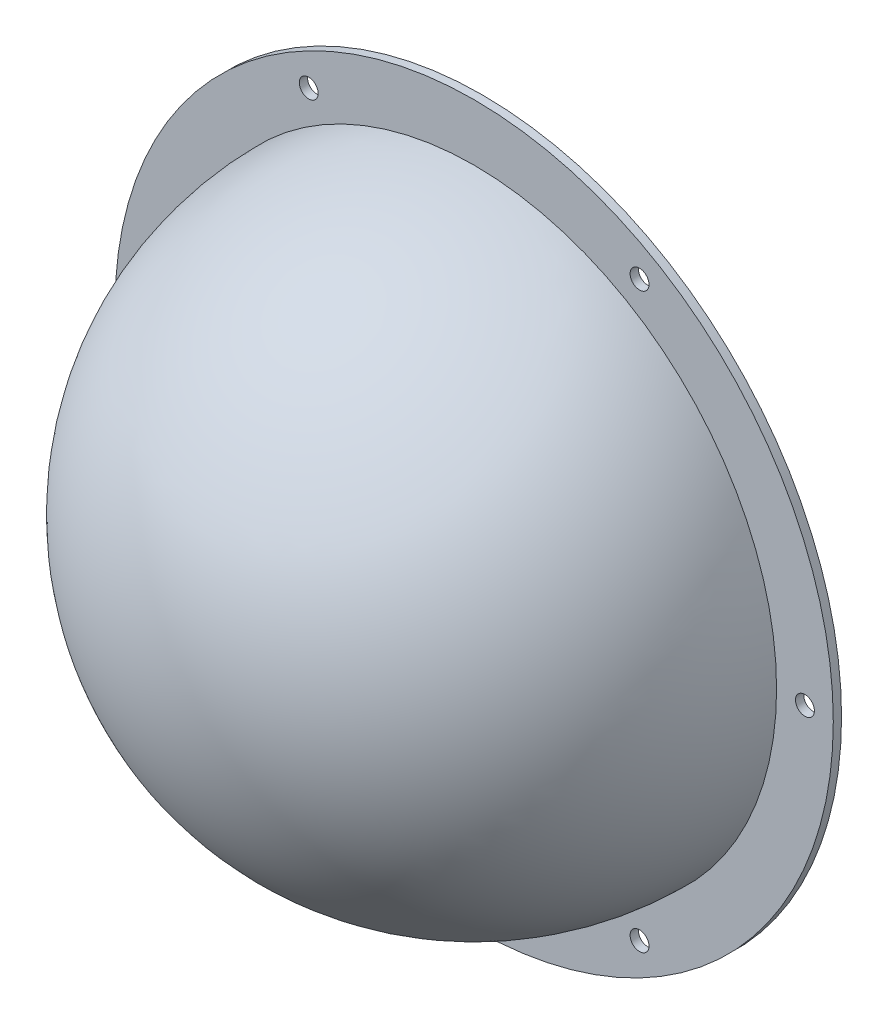
ISO-10303-21;
HEADER;
FILE_DESCRIPTION(('STEP AP214'),'2;1');
FILE_NAME('part.step','',(''),(''),'','','');
FILE_SCHEMA(('AUTOMOTIVE_DESIGN { 1 0 10303 214 1 1 1 1 }'));
ENDSEC;
DATA;
#1=APPLICATION_CONTEXT('core data for automotive mechanical design processes');
#2=APPLICATION_PROTOCOL_DEFINITION('international standard','automotive_design',2000,#1);
#3=PRODUCT_CONTEXT('',#1,'mechanical');
#4=PRODUCT('Part','Part','',(#3));
#5=PRODUCT_RELATED_PRODUCT_CATEGORY('part','',(#4));
#6=PRODUCT_DEFINITION_FORMATION('','',#4);
#7=PRODUCT_DEFINITION_CONTEXT('part definition',#1,'design');
#8=PRODUCT_DEFINITION('design','',#6,#7);
#9=PRODUCT_DEFINITION_SHAPE('','',#8);
#10=(LENGTH_UNIT() NAMED_UNIT(*) SI_UNIT(.MILLI.,.METRE.));
#11=(NAMED_UNIT(*) PLANE_ANGLE_UNIT() SI_UNIT($,.RADIAN.));
#12=(NAMED_UNIT(*) SI_UNIT($,.STERADIAN.) SOLID_ANGLE_UNIT());
#13=UNCERTAINTY_MEASURE_WITH_UNIT(LENGTH_MEASURE(1.E-05),#10,'distance_accuracy_value','');
#14=(GEOMETRIC_REPRESENTATION_CONTEXT(3) GLOBAL_UNCERTAINTY_ASSIGNED_CONTEXT((#13)) GLOBAL_UNIT_ASSIGNED_CONTEXT((#10,
#11,#12)) REPRESENTATION_CONTEXT('',''));
#15=CARTESIAN_POINT('',(0.,0.,0.));
#16=DIRECTION('',(0.,0.,1.));
#17=DIRECTION('',(1.,0.,0.));
#18=AXIS2_PLACEMENT_3D('',#15,#16,#17);
#19=CARTESIAN_POINT('',(0.,0.,0.));
#20=DIRECTION('',(0.,0.,-1.));
#21=DIRECTION('',(1.,0.,0.));
#22=AXIS2_PLACEMENT_3D('',#19,#20,#21);
#23=SPHERICAL_SURFACE('',#22,101.6);
#24=CARTESIAN_POINT('',(0.,0.,0.));
#25=DIRECTION('',(0.,0.,-1.));
#26=DIRECTION('',(-1.,0.,0.));
#27=AXIS2_PLACEMENT_3D('',#24,#25,#26);
#28=CIRCLE('',#27,101.6);
#29=CARTESIAN_POINT('',(-101.6,0.,0.));
#30=VERTEX_POINT('',#29);
#31=EDGE_CURVE('E10',#30,#30,#28,.T.);
#32=ORIENTED_EDGE('',*,*,#31,.F.);
#33=EDGE_LOOP('',(#32));
#34=FACE_BOUND('',#33,.T.);
#35=ADVANCED_FACE('F37',(#34),#23,.T.);
#36=CARTESIAN_POINT('',(120.65,0.,0.));
#37=DIRECTION('',(0.,0.,-1.));
#38=DIRECTION('',(-1.,0.,0.));
#39=AXIS2_PLACEMENT_3D('',#36,#37,#38);
#40=PLANE('',#39);
#41=CARTESIAN_POINT('',(55.5625000000011,-96.2370729955451,0.));
#42=DIRECTION('',(0.,0.,-1.));
#43=DIRECTION('',(-1.,0.,0.));
#44=AXIS2_PLACEMENT_3D('',#41,#42,#43);
#45=CIRCLE('',#44,3.175);
#46=CARTESIAN_POINT('',(52.3875000000011,-96.2370729955451,0.));
#47=VERTEX_POINT('',#46);
#48=EDGE_CURVE('E65',#47,#47,#45,.T.);
#49=ORIENTED_EDGE('',*,*,#48,.T.);
#50=EDGE_LOOP('',(#49));
#51=FACE_BOUND('',#50,.T.);
#52=CARTESIAN_POINT('',(-55.5624999999991,-96.2370729955463,0.));
#53=DIRECTION('',(0.,0.,-1.));
#54=DIRECTION('',(-1.,0.,0.));
#55=AXIS2_PLACEMENT_3D('',#52,#53,#54);
#56=CIRCLE('',#55,3.175);
#57=CARTESIAN_POINT('',(-58.7374999999991,-96.2370729955463,0.));
#58=VERTEX_POINT('',#57);
#59=EDGE_CURVE('E68',#58,#58,#56,.T.);
#60=ORIENTED_EDGE('',*,*,#59,.T.);
#61=EDGE_LOOP('',(#60));
#62=FACE_BOUND('',#61,.T.);
#63=CARTESIAN_POINT('',(-111.125,0.,0.));
#64=DIRECTION('',(0.,0.,-1.));
#65=DIRECTION('',(-1.,0.,0.));
#66=AXIS2_PLACEMENT_3D('',#63,#64,#65);
#67=CIRCLE('',#66,3.175);
#68=CARTESIAN_POINT('',(-114.3,0.,0.));
#69=VERTEX_POINT('',#68);
#70=EDGE_CURVE('E71',#69,#69,#67,.T.);
#71=ORIENTED_EDGE('',*,*,#70,.T.);
#72=EDGE_LOOP('',(#71));
#73=FACE_BOUND('',#72,.T.);
#74=CARTESIAN_POINT('',(-55.5625000000005,96.2370729955455,0.));
#75=DIRECTION('',(0.,0.,-1.));
#76=DIRECTION('',(-1.,0.,0.));
#77=AXIS2_PLACEMENT_3D('',#74,#75,#76);
#78=CIRCLE('',#77,3.175);
#79=CARTESIAN_POINT('',(-58.7375000000005,96.2370729955455,0.));
#80=VERTEX_POINT('',#79);
#81=EDGE_CURVE('E74',#80,#80,#78,.T.);
#82=ORIENTED_EDGE('',*,*,#81,.T.);
#83=EDGE_LOOP('',(#82));
#84=FACE_BOUND('',#83,.T.);
#85=CARTESIAN_POINT('',(55.5624999999998,96.2370729955459,0.));
#86=DIRECTION('',(0.,0.,-1.));
#87=DIRECTION('',(-1.,0.,0.));
#88=AXIS2_PLACEMENT_3D('',#85,#86,#87);
#89=CIRCLE('',#88,3.175);
#90=CARTESIAN_POINT('',(52.3874999999998,96.2370729955459,0.));
#91=VERTEX_POINT('',#90);
#92=EDGE_CURVE('E77',#91,#91,#89,.T.);
#93=ORIENTED_EDGE('',*,*,#92,.T.);
#94=EDGE_LOOP('',(#93));
#95=FACE_BOUND('',#94,.T.);
#96=CARTESIAN_POINT('',(111.125,0.,0.));
#97=DIRECTION('',(0.,0.,-1.));
#98=DIRECTION('',(-1.,0.,0.));
#99=AXIS2_PLACEMENT_3D('',#96,#97,#98);
#100=CIRCLE('',#99,3.175);
#101=CARTESIAN_POINT('',(107.95,0.,0.));
#102=VERTEX_POINT('',#101);
#103=EDGE_CURVE('E59',#102,#102,#100,.T.);
#104=ORIENTED_EDGE('',*,*,#103,.T.);
#105=EDGE_LOOP('',(#104));
#106=FACE_BOUND('',#105,.T.);
#107=CARTESIAN_POINT('',(0.,0.,0.));
#108=DIRECTION('',(0.,0.,-1.));
#109=DIRECTION('',(-1.,0.,0.));
#110=AXIS2_PLACEMENT_3D('',#107,#108,#109);
#111=CIRCLE('',#110,120.65);
#112=CARTESIAN_POINT('',(-120.65,0.,0.));
#113=VERTEX_POINT('',#112);
#114=EDGE_CURVE('E43',#113,#113,#111,.T.);
#115=ORIENTED_EDGE('',*,*,#114,.F.);
#116=EDGE_LOOP('',(#115));
#117=FACE_BOUND('',#116,.T.);
#118=ORIENTED_EDGE('',*,*,#31,.T.);
#119=EDGE_LOOP('',(#118));
#120=FACE_BOUND('',#119,.T.);
#121=ADVANCED_FACE('F107',(#51,#62,#73,#84,#95,#106,#117,#120),#40,.F.);
#122=CARTESIAN_POINT('',(0.,0.,0.));
#123=DIRECTION('',(0.,0.,-1.));
#124=DIRECTION('',(-1.,0.,0.));
#125=AXIS2_PLACEMENT_3D('',#122,#123,#124);
#126=CYLINDRICAL_SURFACE('',#125,120.65);
#127=CARTESIAN_POINT('',(0.,0.,-2.77812500000001));
#128=DIRECTION('',(0.,0.,-1.));
#129=DIRECTION('',(-1.,0.,0.));
#130=AXIS2_PLACEMENT_3D('',#127,#128,#129);
#131=CIRCLE('',#130,120.65);
#132=CARTESIAN_POINT('',(-120.65,0.,-2.77812500000001));
#133=VERTEX_POINT('',#132);
#134=EDGE_CURVE('E47',#133,#133,#131,.T.);
#135=ORIENTED_EDGE('',*,*,#134,.F.);
#136=EDGE_LOOP('',(#135));
#137=FACE_BOUND('',#136,.T.);
#138=ORIENTED_EDGE('',*,*,#114,.T.);
#139=EDGE_LOOP('',(#138));
#140=FACE_BOUND('',#139,.T.);
#141=ADVANCED_FACE('F110',(#137,#140),#126,.T.);
#142=CARTESIAN_POINT('',(98.821875,0.,-2.77812500000001));
#143=DIRECTION('',(0.,0.,1.));
#144=DIRECTION('',(1.,0.,0.));
#145=AXIS2_PLACEMENT_3D('',#142,#143,#144);
#146=PLANE('',#145);
#147=CARTESIAN_POINT('',(55.5625000000011,-96.2370729955451,-2.77812500000001));
#148=DIRECTION('',(0.,0.,1.));
#149=DIRECTION('',(0.50000000000001,-0.866025403784433,0.));
#150=AXIS2_PLACEMENT_3D('',#147,#148,#149);
#151=CIRCLE('',#150,3.175);
#152=CARTESIAN_POINT('',(57.1500000000012,-98.9867036525607,-2.77812500000001));
#153=VERTEX_POINT('',#152);
#154=EDGE_CURVE('E84',#153,#153,#151,.T.);
#155=ORIENTED_EDGE('',*,*,#154,.T.);
#156=EDGE_LOOP('',(#155));
#157=FACE_BOUND('',#156,.T.);
#158=CARTESIAN_POINT('',(-55.5624999999991,-96.2370729955463,-2.77812500000001));
#159=DIRECTION('',(0.,0.,1.));
#160=DIRECTION('',(-0.499999999999992,-0.866025403784443,0.));
#161=AXIS2_PLACEMENT_3D('',#158,#159,#160);
#162=CIRCLE('',#161,3.175);
#163=CARTESIAN_POINT('',(-57.1499999999991,-98.9867036525619,-2.77812500000001));
#164=VERTEX_POINT('',#163);
#165=EDGE_CURVE('E87',#164,#164,#162,.T.);
#166=ORIENTED_EDGE('',*,*,#165,.T.);
#167=EDGE_LOOP('',(#166));
#168=FACE_BOUND('',#167,.T.);
#169=CARTESIAN_POINT('',(-111.125,0.,-2.77812500000001));
#170=DIRECTION('',(0.,0.,1.));
#171=DIRECTION('',(-1.,0.,0.));
#172=AXIS2_PLACEMENT_3D('',#169,#170,#171);
#173=CIRCLE('',#172,3.175);
#174=CARTESIAN_POINT('',(-114.3,0.,-2.77812500000001));
#175=VERTEX_POINT('',#174);
#176=EDGE_CURVE('E90',#175,#175,#173,.T.);
#177=ORIENTED_EDGE('',*,*,#176,.T.);
#178=EDGE_LOOP('',(#177));
#179=FACE_BOUND('',#178,.T.);
#180=CARTESIAN_POINT('',(-55.5625000000005,96.2370729955455,-2.77812500000001));
#181=DIRECTION('',(0.,0.,1.));
#182=DIRECTION('',(-0.500000000000004,0.866025403784436,0.));
#183=AXIS2_PLACEMENT_3D('',#180,#181,#182);
#184=CIRCLE('',#183,3.175);
#185=CARTESIAN_POINT('',(-57.1500000000005,98.9867036525611,-2.77812500000001));
#186=VERTEX_POINT('',#185);
#187=EDGE_CURVE('E83',#186,#186,#184,.T.);
#188=ORIENTED_EDGE('',*,*,#187,.T.);
#189=EDGE_LOOP('',(#188));
#190=FACE_BOUND('',#189,.T.);
#191=CARTESIAN_POINT('',(55.5624999999998,96.2370729955459,-2.77812500000001));
#192=DIRECTION('',(0.,0.,1.));
#193=DIRECTION('',(0.499999999999998,0.86602540378444,0.));
#194=AXIS2_PLACEMENT_3D('',#191,#192,#193);
#195=CIRCLE('',#194,3.175);
#196=CARTESIAN_POINT('',(57.1499999999998,98.9867036525615,-2.77812500000001));
#197=VERTEX_POINT('',#196);
#198=EDGE_CURVE('E80',#197,#197,#195,.T.);
#199=ORIENTED_EDGE('',*,*,#198,.T.);
#200=EDGE_LOOP('',(#199));
#201=FACE_BOUND('',#200,.T.);
#202=CARTESIAN_POINT('',(111.125,0.,-2.77812500000001));
#203=DIRECTION('',(0.,0.,1.));
#204=DIRECTION('',(1.,0.,0.));
#205=AXIS2_PLACEMENT_3D('',#202,#203,#204);
#206=CIRCLE('',#205,3.175);
#207=CARTESIAN_POINT('',(114.3,0.,-2.77812500000001));
#208=VERTEX_POINT('',#207);
#209=EDGE_CURVE('E62',#208,#208,#206,.T.);
#210=ORIENTED_EDGE('',*,*,#209,.T.);
#211=EDGE_LOOP('',(#210));
#212=FACE_BOUND('',#211,.T.);
#213=CARTESIAN_POINT('',(0.,0.,-2.77812500000001));
#214=DIRECTION('',(0.,0.,-1.));
#215=DIRECTION('',(-1.,0.,0.));
#216=AXIS2_PLACEMENT_3D('',#213,#214,#215);
#217=CIRCLE('',#216,98.821875);
#218=CARTESIAN_POINT('',(-98.821875,0.,-2.77812500000001));
#219=VERTEX_POINT('',#218);
#220=EDGE_CURVE('E51',#219,#219,#217,.T.);
#221=ORIENTED_EDGE('',*,*,#220,.F.);
#222=EDGE_LOOP('',(#221));
#223=FACE_BOUND('',#222,.T.);
#224=ORIENTED_EDGE('',*,*,#134,.T.);
#225=EDGE_LOOP('',(#224));
#226=FACE_BOUND('',#225,.T.);
#227=ADVANCED_FACE('F96',(#157,#168,#179,#190,#201,#212,#223,#226),#146,.F.);
#228=CARTESIAN_POINT('',(0.,0.,0.));
#229=DIRECTION('',(0.,0.,-1.));
#230=DIRECTION('',(-1.,0.,0.));
#231=AXIS2_PLACEMENT_3D('',#228,#229,#230);
#232=CYLINDRICAL_SURFACE('',#231,98.821875);
#233=CARTESIAN_POINT('',(0.,0.,0.));
#234=DIRECTION('',(0.,0.,-1.));
#235=DIRECTION('',(-1.,0.,0.));
#236=AXIS2_PLACEMENT_3D('',#233,#234,#235);
#237=CIRCLE('',#236,98.821875);
#238=CARTESIAN_POINT('',(-98.821875,0.,0.));
#239=VERTEX_POINT('',#238);
#240=EDGE_CURVE('E56',#239,#239,#237,.T.);
#241=ORIENTED_EDGE('',*,*,#240,.F.);
#242=EDGE_LOOP('',(#241));
#243=FACE_BOUND('',#242,.T.);
#244=ORIENTED_EDGE('',*,*,#220,.T.);
#245=EDGE_LOOP('',(#244));
#246=FACE_BOUND('',#245,.T.);
#247=ADVANCED_FACE('F128',(#243,#246),#232,.F.);
#248=CARTESIAN_POINT('',(0.,0.,0.));
#249=DIRECTION('',(0.,0.,-1.));
#250=DIRECTION('',(1.,0.,0.));
#251=AXIS2_PLACEMENT_3D('',#248,#249,#250);
#252=SPHERICAL_SURFACE('',#251,98.821875);
#253=ORIENTED_EDGE('',*,*,#240,.T.);
#254=EDGE_LOOP('',(#253));
#255=FACE_BOUND('',#254,.T.);
#256=ADVANCED_FACE('F119',(#255),#252,.F.);
#257=CARTESIAN_POINT('',(111.125,0.,-2.77812500000001));
#258=DIRECTION('',(0.,0.,1.));
#259=DIRECTION('',(1.,0.,0.));
#260=AXIS2_PLACEMENT_3D('',#257,#258,#259);
#261=CYLINDRICAL_SURFACE('',#260,3.175);
#262=ORIENTED_EDGE('',*,*,#209,.F.);
#263=EDGE_LOOP('',(#262));
#264=FACE_BOUND('',#263,.T.);
#265=ORIENTED_EDGE('',*,*,#103,.F.);
#266=EDGE_LOOP('',(#265));
#267=FACE_BOUND('',#266,.T.);
#268=ADVANCED_FACE('F117',(#264,#267),#261,.F.);
#269=CARTESIAN_POINT('',(55.5624999999998,96.2370729955459,-2.77812500000001));
#270=DIRECTION('',(0.,0.,1.));
#271=DIRECTION('',(1.,0.,0.));
#272=AXIS2_PLACEMENT_3D('',#269,#270,#271);
#273=CYLINDRICAL_SURFACE('',#272,3.175);
#274=ORIENTED_EDGE('',*,*,#198,.F.);
#275=EDGE_LOOP('',(#274));
#276=FACE_BOUND('',#275,.T.);
#277=ORIENTED_EDGE('',*,*,#92,.F.);
#278=EDGE_LOOP('',(#277));
#279=FACE_BOUND('',#278,.T.);
#280=ADVANCED_FACE('F103',(#276,#279),#273,.F.);
#281=CARTESIAN_POINT('',(-55.5625000000005,96.2370729955455,-2.77812500000001));
#282=DIRECTION('',(0.,0.,1.));
#283=DIRECTION('',(1.,0.,0.));
#284=AXIS2_PLACEMENT_3D('',#281,#282,#283);
#285=CYLINDRICAL_SURFACE('',#284,3.175);
#286=ORIENTED_EDGE('',*,*,#187,.F.);
#287=EDGE_LOOP('',(#286));
#288=FACE_BOUND('',#287,.T.);
#289=ORIENTED_EDGE('',*,*,#81,.F.);
#290=EDGE_LOOP('',(#289));
#291=FACE_BOUND('',#290,.T.);
#292=ADVANCED_FACE('F99',(#288,#291),#285,.F.);
#293=CARTESIAN_POINT('',(-111.125,0.,-2.77812500000001));
#294=DIRECTION('',(0.,0.,1.));
#295=DIRECTION('',(1.,0.,0.));
#296=AXIS2_PLACEMENT_3D('',#293,#294,#295);
#297=CYLINDRICAL_SURFACE('',#296,3.175);
#298=ORIENTED_EDGE('',*,*,#176,.F.);
#299=EDGE_LOOP('',(#298));
#300=FACE_BOUND('',#299,.T.);
#301=ORIENTED_EDGE('',*,*,#70,.F.);
#302=EDGE_LOOP('',(#301));
#303=FACE_BOUND('',#302,.T.);
#304=ADVANCED_FACE('F102',(#300,#303),#297,.F.);
#305=CARTESIAN_POINT('',(-55.5624999999991,-96.2370729955463,-2.77812500000001));
#306=DIRECTION('',(0.,0.,1.));
#307=DIRECTION('',(1.,0.,0.));
#308=AXIS2_PLACEMENT_3D('',#305,#306,#307);
#309=CYLINDRICAL_SURFACE('',#308,3.175);
#310=ORIENTED_EDGE('',*,*,#165,.F.);
#311=EDGE_LOOP('',(#310));
#312=FACE_BOUND('',#311,.T.);
#313=ORIENTED_EDGE('',*,*,#59,.F.);
#314=EDGE_LOOP('',(#313));
#315=FACE_BOUND('',#314,.T.);
#316=ADVANCED_FACE('F186',(#312,#315),#309,.F.);
#317=CARTESIAN_POINT('',(55.5625000000011,-96.2370729955451,-2.77812500000001));
#318=DIRECTION('',(0.,0.,1.));
#319=DIRECTION('',(1.,0.,0.));
#320=AXIS2_PLACEMENT_3D('',#317,#318,#319);
#321=CYLINDRICAL_SURFACE('',#320,3.175);
#322=ORIENTED_EDGE('',*,*,#154,.F.);
#323=EDGE_LOOP('',(#322));
#324=FACE_BOUND('',#323,.T.);
#325=ORIENTED_EDGE('',*,*,#48,.F.);
#326=EDGE_LOOP('',(#325));
#327=FACE_BOUND('',#326,.T.);
#328=ADVANCED_FACE('F196',(#324,#327),#321,.F.);
#329=CLOSED_SHELL('',(#35,#121,#141,#227,#247,#256,#268,#280,#292,#304,#316,#328));
#330=MANIFOLD_SOLID_BREP('B2',#329);
#331=ADVANCED_BREP_SHAPE_REPRESENTATION('',(#18,#330),#14);
#332=SHAPE_DEFINITION_REPRESENTATION(#9,#331);
ENDSEC;
END-ISO-10303-21;
